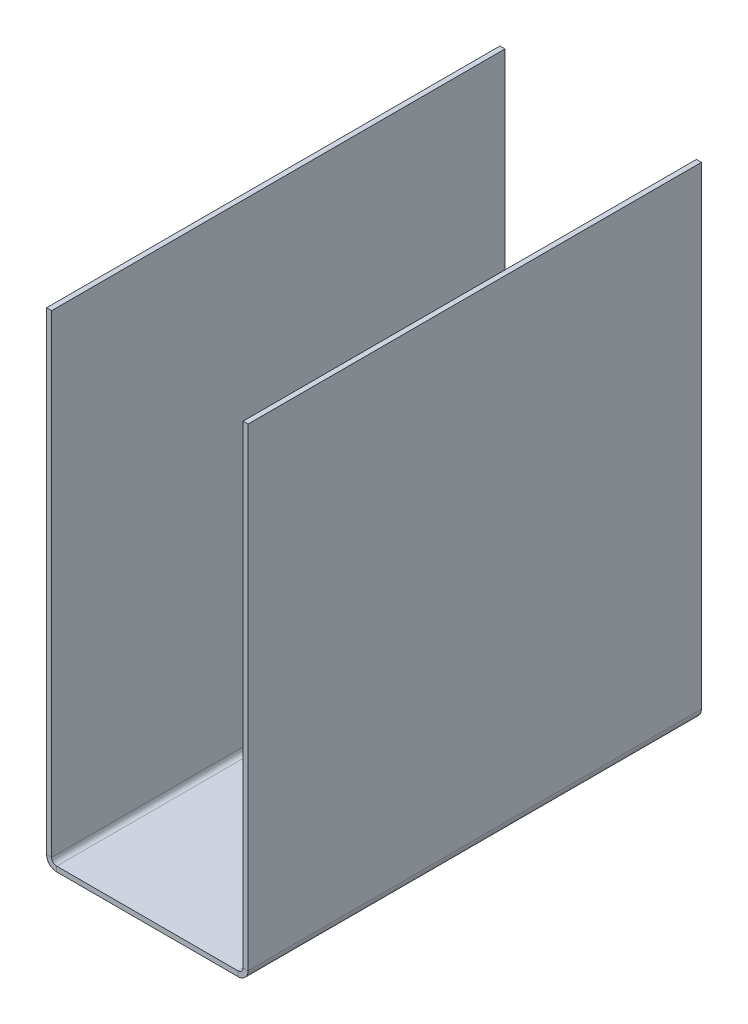
ISO-10303-21;
HEADER;
FILE_DESCRIPTION(('STEP AP214'),'2;1');
FILE_NAME('part.step','',(''),(''),'','','');
FILE_SCHEMA(('AUTOMOTIVE_DESIGN { 1 0 10303 214 1 1 1 1 }'));
ENDSEC;
DATA;
#1=APPLICATION_CONTEXT('core data for automotive mechanical design processes');
#2=APPLICATION_PROTOCOL_DEFINITION('international standard','automotive_design',2000,#1);
#3=PRODUCT_CONTEXT('',#1,'mechanical');
#4=PRODUCT('Part','Part','',(#3));
#5=PRODUCT_RELATED_PRODUCT_CATEGORY('part','',(#4));
#6=PRODUCT_DEFINITION_FORMATION('','',#4);
#7=PRODUCT_DEFINITION_CONTEXT('part definition',#1,'design');
#8=PRODUCT_DEFINITION('design','',#6,#7);
#9=PRODUCT_DEFINITION_SHAPE('','',#8);
#10=(LENGTH_UNIT() NAMED_UNIT(*) SI_UNIT(.MILLI.,.METRE.));
#11=(NAMED_UNIT(*) PLANE_ANGLE_UNIT() SI_UNIT($,.RADIAN.));
#12=(NAMED_UNIT(*) SI_UNIT($,.STERADIAN.) SOLID_ANGLE_UNIT());
#13=UNCERTAINTY_MEASURE_WITH_UNIT(LENGTH_MEASURE(1.E-05),#10,'distance_accuracy_value','');
#14=(GEOMETRIC_REPRESENTATION_CONTEXT(3) GLOBAL_UNCERTAINTY_ASSIGNED_CONTEXT((#13)) GLOBAL_UNIT_ASSIGNED_CONTEXT((#10,
#11,#12)) REPRESENTATION_CONTEXT('',''));
#15=CARTESIAN_POINT('',(0.,0.,0.));
#16=DIRECTION('',(0.,0.,1.));
#17=DIRECTION('',(1.,0.,0.));
#18=AXIS2_PLACEMENT_3D('',#15,#16,#17);
#19=CARTESIAN_POINT('',(-95.,-235.,5.));
#20=DIRECTION('',(0.,0.,1.));
#21=DIRECTION('',(-1.,0.,0.));
#22=AXIS2_PLACEMENT_3D('',#19,#20,#21);
#23=PLANE('',#22);
#24=DIRECTION('',(0.,1.,0.));
#25=VECTOR('',#24,1.);
#26=CARTESIAN_POINT('',(90.,-235.,5.));
#27=LINE('',#26,#25);
#28=CARTESIAN_POINT('',(90.,-240.,5.));
#29=VERTEX_POINT('',#28);
#30=CARTESIAN_POINT('',(90.,-235.,5.));
#31=VERTEX_POINT('',#30);
#32=EDGE_CURVE('E11',#29,#31,#27,.T.);
#33=ORIENTED_EDGE('',*,*,#32,.F.);
#34=DIRECTION('',(1.,0.,0.));
#35=VECTOR('',#34,1.);
#36=CARTESIAN_POINT('',(-95.,-240.,5.));
#37=LINE('',#36,#35);
#38=CARTESIAN_POINT('',(-90.,-240.,5.));
#39=VERTEX_POINT('',#38);
#40=EDGE_CURVE('E93',#29,#39,#37,.F.);
#41=ORIENTED_EDGE('',*,*,#40,.T.);
#42=DIRECTION('',(0.,1.,0.));
#43=VECTOR('',#42,1.);
#44=CARTESIAN_POINT('',(-90.,-235.,5.));
#45=LINE('',#44,#43);
#46=CARTESIAN_POINT('',(-90.,-235.,5.));
#47=VERTEX_POINT('',#46);
#48=EDGE_CURVE('E46',#39,#47,#45,.T.);
#49=ORIENTED_EDGE('',*,*,#48,.T.);
#50=DIRECTION('',(-1.,0.,0.));
#51=VECTOR('',#50,1.);
#52=CARTESIAN_POINT('',(-95.,-235.,5.));
#53=LINE('',#52,#51);
#54=EDGE_CURVE('E95',#31,#47,#53,.T.);
#55=ORIENTED_EDGE('',*,*,#54,.F.);
#56=EDGE_LOOP('',(#33,#41,#49,#55));
#57=FACE_BOUND('',#56,.T.);
#58=ADVANCED_FACE('F36',(#57),#23,.F.);
#59=CARTESIAN_POINT('',(-90.,-230.,5.));
#60=DIRECTION('',(0.,0.,-1.));
#61=DIRECTION('',(-1.,0.,0.));
#62=AXIS2_PLACEMENT_3D('',#59,#60,#61);
#63=PLANE('',#62);
#64=ORIENTED_EDGE('',*,*,#48,.F.);
#65=CARTESIAN_POINT('',(-90.,-230.,5.));
#66=DIRECTION('',(0.,0.,1.));
#67=DIRECTION('',(1.,0.,0.));
#68=AXIS2_PLACEMENT_3D('',#65,#66,#67);
#69=CIRCLE('',#68,10.);
#70=CARTESIAN_POINT('',(-99.9999999999999,-230.,5.));
#71=VERTEX_POINT('',#70);
#72=EDGE_CURVE('E134',#39,#71,#69,.F.);
#73=ORIENTED_EDGE('',*,*,#72,.T.);
#74=DIRECTION('',(1.,0.,0.));
#75=VECTOR('',#74,1.);
#76=CARTESIAN_POINT('',(-95.,-230.,5.));
#77=LINE('',#76,#75);
#78=CARTESIAN_POINT('',(-95.,-230.,5.));
#79=VERTEX_POINT('',#78);
#80=EDGE_CURVE('E161',#71,#79,#77,.T.);
#81=ORIENTED_EDGE('',*,*,#80,.T.);
#82=CARTESIAN_POINT('',(-90.,-230.,5.));
#83=DIRECTION('',(0.,0.,1.));
#84=DIRECTION('',(1.,0.,0.));
#85=AXIS2_PLACEMENT_3D('',#82,#83,#84);
#86=CIRCLE('',#85,5.);
#87=EDGE_CURVE('E170',#47,#79,#86,.F.);
#88=ORIENTED_EDGE('',*,*,#87,.F.);
#89=EDGE_LOOP('',(#64,#73,#81,#88));
#90=FACE_BOUND('',#89,.T.);
#91=ADVANCED_FACE('F169',(#90),#63,.T.);
#92=CARTESIAN_POINT('',(-95.,240.,5.));
#93=DIRECTION('',(0.,0.,1.));
#94=DIRECTION('',(0.,1.,0.));
#95=AXIS2_PLACEMENT_3D('',#92,#93,#94);
#96=PLANE('',#95);
#97=ORIENTED_EDGE('',*,*,#80,.F.);
#98=DIRECTION('',(0.,-1.,0.));
#99=VECTOR('',#98,1.);
#100=CARTESIAN_POINT('',(-100.,240.,5.));
#101=LINE('',#100,#99);
#102=CARTESIAN_POINT('',(-100.,240.,5.));
#103=VERTEX_POINT('',#102);
#104=EDGE_CURVE('E131',#71,#103,#101,.F.);
#105=ORIENTED_EDGE('',*,*,#104,.T.);
#106=DIRECTION('',(1.,0.,0.));
#107=VECTOR('',#106,1.);
#108=CARTESIAN_POINT('',(-95.,240.,5.));
#109=LINE('',#108,#107);
#110=CARTESIAN_POINT('',(-95.,240.,5.));
#111=VERTEX_POINT('',#110);
#112=EDGE_CURVE('E158',#103,#111,#109,.T.);
#113=ORIENTED_EDGE('',*,*,#112,.T.);
#114=DIRECTION('',(0.,1.,0.));
#115=VECTOR('',#114,1.);
#116=CARTESIAN_POINT('',(-95.,240.,5.));
#117=LINE('',#116,#115);
#118=EDGE_CURVE('E189',#79,#111,#117,.T.);
#119=ORIENTED_EDGE('',*,*,#118,.F.);
#120=EDGE_LOOP('',(#97,#105,#113,#119));
#121=FACE_BOUND('',#120,.T.);
#122=ADVANCED_FACE('F190',(#121),#96,.F.);
#123=CARTESIAN_POINT('',(-95.,240.,455.));
#124=DIRECTION('',(0.,1.,0.));
#125=DIRECTION('',(0.,0.,-1.));
#126=AXIS2_PLACEMENT_3D('',#123,#124,#125);
#127=PLANE('',#126);
#128=ORIENTED_EDGE('',*,*,#112,.F.);
#129=DIRECTION('',(0.,0.,1.));
#130=VECTOR('',#129,1.);
#131=CARTESIAN_POINT('',(-100.,240.,455.));
#132=LINE('',#131,#130);
#133=CARTESIAN_POINT('',(-100.,240.,455.));
#134=VERTEX_POINT('',#133);
#135=EDGE_CURVE('E227',#134,#103,#132,.F.);
#136=ORIENTED_EDGE('',*,*,#135,.F.);
#137=DIRECTION('',(1.,0.,0.));
#138=VECTOR('',#137,1.);
#139=CARTESIAN_POINT('',(-95.,240.,455.));
#140=LINE('',#139,#138);
#141=CARTESIAN_POINT('',(-95.,240.,455.));
#142=VERTEX_POINT('',#141);
#143=EDGE_CURVE('E155',#134,#142,#140,.T.);
#144=ORIENTED_EDGE('',*,*,#143,.T.);
#145=DIRECTION('',(0.,0.,-1.));
#146=VECTOR('',#145,1.);
#147=CARTESIAN_POINT('',(-95.,240.,455.));
#148=LINE('',#147,#146);
#149=EDGE_CURVE('E194',#142,#111,#148,.T.);
#150=ORIENTED_EDGE('',*,*,#149,.T.);
#151=EDGE_LOOP('',(#128,#136,#144,#150));
#152=FACE_BOUND('',#151,.T.);
#153=ADVANCED_FACE('F238',(#152),#127,.T.);
#154=CARTESIAN_POINT('',(-95.,240.,455.));
#155=DIRECTION('',(0.,0.,1.));
#156=DIRECTION('',(0.,1.,0.));
#157=AXIS2_PLACEMENT_3D('',#154,#155,#156);
#158=PLANE('',#157);
#159=ORIENTED_EDGE('',*,*,#143,.F.);
#160=DIRECTION('',(0.,-1.,0.));
#161=VECTOR('',#160,1.);
#162=CARTESIAN_POINT('',(-100.,240.,455.));
#163=LINE('',#162,#161);
#164=CARTESIAN_POINT('',(-100.,-230.,455.));
#165=VERTEX_POINT('',#164);
#166=EDGE_CURVE('E124',#165,#134,#163,.F.);
#167=ORIENTED_EDGE('',*,*,#166,.F.);
#168=DIRECTION('',(1.,0.,0.));
#169=VECTOR('',#168,1.);
#170=CARTESIAN_POINT('',(-95.,-230.,455.));
#171=LINE('',#170,#169);
#172=CARTESIAN_POINT('',(-95.,-230.,455.));
#173=VERTEX_POINT('',#172);
#174=EDGE_CURVE('E152',#165,#173,#171,.T.);
#175=ORIENTED_EDGE('',*,*,#174,.T.);
#176=DIRECTION('',(0.,1.,0.));
#177=VECTOR('',#176,1.);
#178=CARTESIAN_POINT('',(-95.,240.,455.));
#179=LINE('',#178,#177);
#180=EDGE_CURVE('E200',#173,#142,#179,.T.);
#181=ORIENTED_EDGE('',*,*,#180,.T.);
#182=EDGE_LOOP('',(#159,#167,#175,#181));
#183=FACE_BOUND('',#182,.T.);
#184=ADVANCED_FACE('F288',(#183),#158,.T.);
#185=CARTESIAN_POINT('',(-90.,-230.,455.));
#186=DIRECTION('',(0.,0.,1.));
#187=DIRECTION('',(1.,0.,0.));
#188=AXIS2_PLACEMENT_3D('',#185,#186,#187);
#189=PLANE('',#188);
#190=ORIENTED_EDGE('',*,*,#174,.F.);
#191=CARTESIAN_POINT('',(-90.,-230.,455.));
#192=DIRECTION('',(0.,0.,1.));
#193=DIRECTION('',(1.,0.,0.));
#194=AXIS2_PLACEMENT_3D('',#191,#192,#193);
#195=CIRCLE('',#194,10.);
#196=CARTESIAN_POINT('',(-90.,-240.,455.));
#197=VERTEX_POINT('',#196);
#198=EDGE_CURVE('E129',#165,#197,#195,.T.);
#199=ORIENTED_EDGE('',*,*,#198,.T.);
#200=DIRECTION('',(0.,1.,0.));
#201=VECTOR('',#200,1.);
#202=CARTESIAN_POINT('',(-90.,-235.,455.));
#203=LINE('',#202,#201);
#204=CARTESIAN_POINT('',(-90.,-235.,455.));
#205=VERTEX_POINT('',#204);
#206=EDGE_CURVE('E150',#197,#205,#203,.T.);
#207=ORIENTED_EDGE('',*,*,#206,.T.);
#208=CARTESIAN_POINT('',(-90.,-230.,455.));
#209=DIRECTION('',(0.,0.,-1.));
#210=DIRECTION('',(-1.,0.,0.));
#211=AXIS2_PLACEMENT_3D('',#208,#209,#210);
#212=CIRCLE('',#211,5.);
#213=EDGE_CURVE('E186',#173,#205,#212,.F.);
#214=ORIENTED_EDGE('',*,*,#213,.F.);
#215=EDGE_LOOP('',(#190,#199,#207,#214));
#216=FACE_BOUND('',#215,.T.);
#217=ADVANCED_FACE('F290',(#216),#189,.T.);
#218=CARTESIAN_POINT('',(-95.,-235.,455.));
#219=DIRECTION('',(0.,0.,1.));
#220=DIRECTION('',(-1.,0.,0.));
#221=AXIS2_PLACEMENT_3D('',#218,#219,#220);
#222=PLANE('',#221);
#223=ORIENTED_EDGE('',*,*,#206,.F.);
#224=DIRECTION('',(1.,0.,0.));
#225=VECTOR('',#224,1.);
#226=CARTESIAN_POINT('',(-95.,-240.,455.));
#227=LINE('',#226,#225);
#228=CARTESIAN_POINT('',(90.,-240.,455.));
#229=VERTEX_POINT('',#228);
#230=EDGE_CURVE('E123',#229,#197,#227,.F.);
#231=ORIENTED_EDGE('',*,*,#230,.F.);
#232=DIRECTION('',(0.,1.,0.));
#233=VECTOR('',#232,1.);
#234=CARTESIAN_POINT('',(90.,-235.,455.));
#235=LINE('',#234,#233);
#236=CARTESIAN_POINT('',(90.,-235.,455.));
#237=VERTEX_POINT('',#236);
#238=EDGE_CURVE('E147',#229,#237,#235,.T.);
#239=ORIENTED_EDGE('',*,*,#238,.T.);
#240=DIRECTION('',(-1.,0.,0.));
#241=VECTOR('',#240,1.);
#242=CARTESIAN_POINT('',(-95.,-235.,455.));
#243=LINE('',#242,#241);
#244=EDGE_CURVE('E245',#237,#205,#243,.T.);
#245=ORIENTED_EDGE('',*,*,#244,.T.);
#246=EDGE_LOOP('',(#223,#231,#239,#245));
#247=FACE_BOUND('',#246,.T.);
#248=ADVANCED_FACE('F293',(#247),#222,.T.);
#249=CARTESIAN_POINT('',(90.,-230.,455.));
#250=DIRECTION('',(0.,0.,1.));
#251=DIRECTION('',(1.,0.,0.));
#252=AXIS2_PLACEMENT_3D('',#249,#250,#251);
#253=PLANE('',#252);
#254=ORIENTED_EDGE('',*,*,#238,.F.);
#255=CARTESIAN_POINT('',(90.,-230.,455.));
#256=DIRECTION('',(0.,0.,1.));
#257=DIRECTION('',(1.,0.,0.));
#258=AXIS2_PLACEMENT_3D('',#255,#256,#257);
#259=CIRCLE('',#258,10.);
#260=CARTESIAN_POINT('',(100.,-230.,455.));
#261=VERTEX_POINT('',#260);
#262=EDGE_CURVE('E111',#229,#261,#259,.T.);
#263=ORIENTED_EDGE('',*,*,#262,.T.);
#264=DIRECTION('',(-1.,0.,0.));
#265=VECTOR('',#264,1.);
#266=CARTESIAN_POINT('',(95.,-230.,455.));
#267=LINE('',#266,#265);
#268=CARTESIAN_POINT('',(95.,-230.,455.));
#269=VERTEX_POINT('',#268);
#270=EDGE_CURVE('E144',#261,#269,#267,.T.);
#271=ORIENTED_EDGE('',*,*,#270,.T.);
#272=CARTESIAN_POINT('',(90.,-230.,455.));
#273=DIRECTION('',(0.,0.,-1.));
#274=DIRECTION('',(-1.,0.,0.));
#275=AXIS2_PLACEMENT_3D('',#272,#273,#274);
#276=CIRCLE('',#275,5.);
#277=EDGE_CURVE('E195',#237,#269,#276,.F.);
#278=ORIENTED_EDGE('',*,*,#277,.F.);
#279=EDGE_LOOP('',(#254,#263,#271,#278));
#280=FACE_BOUND('',#279,.T.);
#281=ADVANCED_FACE('F320',(#280),#253,.T.);
#282=CARTESIAN_POINT('',(95.,-235.,455.));
#283=DIRECTION('',(0.,0.,1.));
#284=DIRECTION('',(0.,-1.,0.));
#285=AXIS2_PLACEMENT_3D('',#282,#283,#284);
#286=PLANE('',#285);
#287=ORIENTED_EDGE('',*,*,#270,.F.);
#288=DIRECTION('',(0.,1.,0.));
#289=VECTOR('',#288,1.);
#290=CARTESIAN_POINT('',(100.,-235.,455.));
#291=LINE('',#290,#289);
#292=CARTESIAN_POINT('',(100.,240.,455.));
#293=VERTEX_POINT('',#292);
#294=EDGE_CURVE('E219',#293,#261,#291,.F.);
#295=ORIENTED_EDGE('',*,*,#294,.F.);
#296=DIRECTION('',(-1.,0.,0.));
#297=VECTOR('',#296,1.);
#298=CARTESIAN_POINT('',(95.,240.,455.));
#299=LINE('',#298,#297);
#300=CARTESIAN_POINT('',(95.,240.,455.));
#301=VERTEX_POINT('',#300);
#302=EDGE_CURVE('E141',#293,#301,#299,.T.);
#303=ORIENTED_EDGE('',*,*,#302,.T.);
#304=DIRECTION('',(0.,-1.,0.));
#305=VECTOR('',#304,1.);
#306=CARTESIAN_POINT('',(95.,-235.,455.));
#307=LINE('',#306,#305);
#308=EDGE_CURVE('E251',#301,#269,#307,.T.);
#309=ORIENTED_EDGE('',*,*,#308,.T.);
#310=EDGE_LOOP('',(#287,#295,#303,#309));
#311=FACE_BOUND('',#310,.T.);
#312=ADVANCED_FACE('F269',(#311),#286,.T.);
#313=CARTESIAN_POINT('',(95.,240.,455.));
#314=DIRECTION('',(0.,-1.,0.));
#315=DIRECTION('',(0.,0.,-1.));
#316=AXIS2_PLACEMENT_3D('',#313,#314,#315);
#317=PLANE('',#316);
#318=ORIENTED_EDGE('',*,*,#302,.F.);
#319=DIRECTION('',(0.,0.,1.));
#320=VECTOR('',#319,1.);
#321=CARTESIAN_POINT('',(100.,240.,455.));
#322=LINE('',#321,#320);
#323=CARTESIAN_POINT('',(100.,240.,5.));
#324=VERTEX_POINT('',#323);
#325=EDGE_CURVE('E116',#293,#324,#322,.F.);
#326=ORIENTED_EDGE('',*,*,#325,.T.);
#327=DIRECTION('',(-1.,0.,0.));
#328=VECTOR('',#327,1.);
#329=CARTESIAN_POINT('',(95.,240.,5.));
#330=LINE('',#329,#328);
#331=CARTESIAN_POINT('',(95.,240.,5.));
#332=VERTEX_POINT('',#331);
#333=EDGE_CURVE('E138',#324,#332,#330,.T.);
#334=ORIENTED_EDGE('',*,*,#333,.T.);
#335=DIRECTION('',(0.,0.,-1.));
#336=VECTOR('',#335,1.);
#337=CARTESIAN_POINT('',(95.,240.,455.));
#338=LINE('',#337,#336);
#339=EDGE_CURVE('E254',#301,#332,#338,.T.);
#340=ORIENTED_EDGE('',*,*,#339,.F.);
#341=EDGE_LOOP('',(#318,#326,#334,#340));
#342=FACE_BOUND('',#341,.T.);
#343=ADVANCED_FACE('F325',(#342),#317,.F.);
#344=CARTESIAN_POINT('',(95.,-235.,5.));
#345=DIRECTION('',(0.,0.,1.));
#346=DIRECTION('',(0.,-1.,0.));
#347=AXIS2_PLACEMENT_3D('',#344,#345,#346);
#348=PLANE('',#347);
#349=ORIENTED_EDGE('',*,*,#333,.F.);
#350=DIRECTION('',(0.,1.,0.));
#351=VECTOR('',#350,1.);
#352=CARTESIAN_POINT('',(100.,-235.,5.));
#353=LINE('',#352,#351);
#354=CARTESIAN_POINT('',(100.,-230.,5.));
#355=VERTEX_POINT('',#354);
#356=EDGE_CURVE('E217',#324,#355,#353,.F.);
#357=ORIENTED_EDGE('',*,*,#356,.T.);
#358=DIRECTION('',(-1.,0.,0.));
#359=VECTOR('',#358,1.);
#360=CARTESIAN_POINT('',(95.,-230.,5.));
#361=LINE('',#360,#359);
#362=CARTESIAN_POINT('',(95.,-230.,5.));
#363=VERTEX_POINT('',#362);
#364=EDGE_CURVE('E40',#355,#363,#361,.T.);
#365=ORIENTED_EDGE('',*,*,#364,.T.);
#366=DIRECTION('',(0.,-1.,0.));
#367=VECTOR('',#366,1.);
#368=CARTESIAN_POINT('',(95.,-235.,5.));
#369=LINE('',#368,#367);
#370=EDGE_CURVE('E248',#332,#363,#369,.T.);
#371=ORIENTED_EDGE('',*,*,#370,.F.);
#372=EDGE_LOOP('',(#349,#357,#365,#371));
#373=FACE_BOUND('',#372,.T.);
#374=ADVANCED_FACE('F279',(#373),#348,.F.);
#375=CARTESIAN_POINT('',(90.,-230.,5.));
#376=DIRECTION('',(0.,0.,-1.));
#377=DIRECTION('',(-1.,0.,0.));
#378=AXIS2_PLACEMENT_3D('',#375,#376,#377);
#379=PLANE('',#378);
#380=CARTESIAN_POINT('',(90.,-230.,5.));
#381=DIRECTION('',(0.,0.,1.));
#382=DIRECTION('',(1.,0.,0.));
#383=AXIS2_PLACEMENT_3D('',#380,#381,#382);
#384=CIRCLE('',#383,10.);
#385=EDGE_CURVE('E108',#355,#29,#384,.F.);
#386=ORIENTED_EDGE('',*,*,#385,.T.);
#387=ORIENTED_EDGE('',*,*,#32,.T.);
#388=CARTESIAN_POINT('',(90.,-230.,5.));
#389=DIRECTION('',(0.,0.,1.));
#390=DIRECTION('',(1.,0.,0.));
#391=AXIS2_PLACEMENT_3D('',#388,#389,#390);
#392=CIRCLE('',#391,5.);
#393=EDGE_CURVE('E212',#363,#31,#392,.F.);
#394=ORIENTED_EDGE('',*,*,#393,.F.);
#395=ORIENTED_EDGE('',*,*,#364,.F.);
#396=EDGE_LOOP('',(#386,#387,#394,#395));
#397=FACE_BOUND('',#396,.T.);
#398=ADVANCED_FACE('F38',(#397),#379,.T.);
#399=CARTESIAN_POINT('',(95.,-235.,455.));
#400=DIRECTION('',(1.,0.,0.));
#401=DIRECTION('',(0.,1.,0.));
#402=AXIS2_PLACEMENT_3D('',#399,#400,#401);
#403=PLANE('',#402);
#404=ORIENTED_EDGE('',*,*,#370,.T.);
#405=DIRECTION('',(0.,0.,-1.));
#406=VECTOR('',#405,1.);
#407=CARTESIAN_POINT('',(95.,-230.,455.));
#408=LINE('',#407,#406);
#409=EDGE_CURVE('E202',#363,#269,#408,.F.);
#410=ORIENTED_EDGE('',*,*,#409,.T.);
#411=ORIENTED_EDGE('',*,*,#308,.F.);
#412=ORIENTED_EDGE('',*,*,#339,.T.);
#413=EDGE_LOOP('',(#404,#410,#411,#412));
#414=FACE_BOUND('',#413,.T.);
#415=ADVANCED_FACE('F274',(#414),#403,.F.);
#416=CARTESIAN_POINT('',(-95.,-235.,455.));
#417=DIRECTION('',(0.,-1.,0.));
#418=DIRECTION('',(0.,0.,-1.));
#419=AXIS2_PLACEMENT_3D('',#416,#417,#418);
#420=PLANE('',#419);
#421=ORIENTED_EDGE('',*,*,#54,.T.);
#422=DIRECTION('',(0.,0.,-1.));
#423=VECTOR('',#422,1.);
#424=CARTESIAN_POINT('',(-90.,-235.,455.));
#425=LINE('',#424,#423);
#426=EDGE_CURVE('E185',#47,#205,#425,.F.);
#427=ORIENTED_EDGE('',*,*,#426,.T.);
#428=ORIENTED_EDGE('',*,*,#244,.F.);
#429=DIRECTION('',(0.,0.,-1.));
#430=VECTOR('',#429,1.);
#431=CARTESIAN_POINT('',(90.,-235.,5.));
#432=LINE('',#431,#430);
#433=EDGE_CURVE('E206',#237,#31,#432,.T.);
#434=ORIENTED_EDGE('',*,*,#433,.T.);
#435=EDGE_LOOP('',(#421,#427,#428,#434));
#436=FACE_BOUND('',#435,.T.);
#437=ADVANCED_FACE('F295',(#436),#420,.F.);
#438=CARTESIAN_POINT('',(-95.,240.,455.));
#439=DIRECTION('',(-1.,0.,0.));
#440=DIRECTION('',(0.,-1.,0.));
#441=AXIS2_PLACEMENT_3D('',#438,#439,#440);
#442=PLANE('',#441);
#443=ORIENTED_EDGE('',*,*,#180,.F.);
#444=DIRECTION('',(0.,0.,-1.));
#445=VECTOR('',#444,1.);
#446=CARTESIAN_POINT('',(-95.,-230.,5.));
#447=LINE('',#446,#445);
#448=EDGE_CURVE('E183',#173,#79,#447,.T.);
#449=ORIENTED_EDGE('',*,*,#448,.T.);
#450=ORIENTED_EDGE('',*,*,#118,.T.);
#451=ORIENTED_EDGE('',*,*,#149,.F.);
#452=EDGE_LOOP('',(#443,#449,#450,#451));
#453=FACE_BOUND('',#452,.T.);
#454=ADVANCED_FACE('F198',(#453),#442,.F.);
#455=CARTESIAN_POINT('',(90.,-230.,455.));
#456=DIRECTION('',(0.,0.,1.));
#457=DIRECTION('',(1.,0.,0.));
#458=AXIS2_PLACEMENT_3D('',#455,#456,#457);
#459=CYLINDRICAL_SURFACE('',#458,5.);
#460=ORIENTED_EDGE('',*,*,#277,.T.);
#461=ORIENTED_EDGE('',*,*,#409,.F.);
#462=ORIENTED_EDGE('',*,*,#393,.T.);
#463=ORIENTED_EDGE('',*,*,#433,.F.);
#464=EDGE_LOOP('',(#460,#461,#462,#463));
#465=FACE_BOUND('',#464,.T.);
#466=ADVANCED_FACE('F262',(#465),#459,.F.);
#467=CARTESIAN_POINT('',(-90.,-230.,455.));
#468=DIRECTION('',(0.,0.,1.));
#469=DIRECTION('',(1.,0.,0.));
#470=AXIS2_PLACEMENT_3D('',#467,#468,#469);
#471=CYLINDRICAL_SURFACE('',#470,5.);
#472=ORIENTED_EDGE('',*,*,#213,.T.);
#473=ORIENTED_EDGE('',*,*,#426,.F.);
#474=ORIENTED_EDGE('',*,*,#87,.T.);
#475=ORIENTED_EDGE('',*,*,#448,.F.);
#476=EDGE_LOOP('',(#472,#473,#474,#475));
#477=FACE_BOUND('',#476,.T.);
#478=ADVANCED_FACE('F181',(#477),#471,.F.);
#479=CARTESIAN_POINT('',(100.,-235.,455.));
#480=DIRECTION('',(1.,0.,0.));
#481=DIRECTION('',(0.,1.,0.));
#482=AXIS2_PLACEMENT_3D('',#479,#480,#481);
#483=PLANE('',#482);
#484=ORIENTED_EDGE('',*,*,#356,.F.);
#485=ORIENTED_EDGE('',*,*,#325,.F.);
#486=ORIENTED_EDGE('',*,*,#294,.T.);
#487=DIRECTION('',(0.,0.,1.));
#488=VECTOR('',#487,1.);
#489=CARTESIAN_POINT('',(100.,-230.,455.));
#490=LINE('',#489,#488);
#491=EDGE_CURVE('E115',#355,#261,#490,.T.);
#492=ORIENTED_EDGE('',*,*,#491,.F.);
#493=EDGE_LOOP('',(#484,#485,#486,#492));
#494=FACE_BOUND('',#493,.T.);
#495=ADVANCED_FACE('F340',(#494),#483,.T.);
#496=CARTESIAN_POINT('',(-95.,-240.,455.));
#497=DIRECTION('',(0.,-1.,0.));
#498=DIRECTION('',(0.,0.,-1.));
#499=AXIS2_PLACEMENT_3D('',#496,#497,#498);
#500=PLANE('',#499);
#501=ORIENTED_EDGE('',*,*,#40,.F.);
#502=DIRECTION('',(0.,0.,-1.));
#503=VECTOR('',#502,1.);
#504=CARTESIAN_POINT('',(90.,-240.,455.));
#505=LINE('',#504,#503);
#506=EDGE_CURVE('E105',#229,#29,#505,.T.);
#507=ORIENTED_EDGE('',*,*,#506,.F.);
#508=ORIENTED_EDGE('',*,*,#230,.T.);
#509=DIRECTION('',(0.,0.,-1.));
#510=VECTOR('',#509,1.);
#511=CARTESIAN_POINT('',(-90.,-240.,455.));
#512=LINE('',#511,#510);
#513=EDGE_CURVE('E121',#39,#197,#512,.F.);
#514=ORIENTED_EDGE('',*,*,#513,.F.);
#515=EDGE_LOOP('',(#501,#507,#508,#514));
#516=FACE_BOUND('',#515,.T.);
#517=ADVANCED_FACE('F119',(#516),#500,.T.);
#518=CARTESIAN_POINT('',(-100.,240.,455.));
#519=DIRECTION('',(-1.,0.,0.));
#520=DIRECTION('',(0.,-1.,0.));
#521=AXIS2_PLACEMENT_3D('',#518,#519,#520);
#522=PLANE('',#521);
#523=ORIENTED_EDGE('',*,*,#166,.T.);
#524=ORIENTED_EDGE('',*,*,#135,.T.);
#525=ORIENTED_EDGE('',*,*,#104,.F.);
#526=DIRECTION('',(0.,0.,1.));
#527=VECTOR('',#526,1.);
#528=CARTESIAN_POINT('',(-100.,-230.,455.));
#529=LINE('',#528,#527);
#530=EDGE_CURVE('E213',#165,#71,#529,.F.);
#531=ORIENTED_EDGE('',*,*,#530,.F.);
#532=EDGE_LOOP('',(#523,#524,#525,#531));
#533=FACE_BOUND('',#532,.T.);
#534=ADVANCED_FACE('F233',(#533),#522,.T.);
#535=CARTESIAN_POINT('',(90.,-230.,455.));
#536=DIRECTION('',(0.,0.,1.));
#537=DIRECTION('',(1.,0.,0.));
#538=AXIS2_PLACEMENT_3D('',#535,#536,#537);
#539=CYLINDRICAL_SURFACE('',#538,10.);
#540=ORIENTED_EDGE('',*,*,#262,.F.);
#541=ORIENTED_EDGE('',*,*,#506,.T.);
#542=ORIENTED_EDGE('',*,*,#385,.F.);
#543=ORIENTED_EDGE('',*,*,#491,.T.);
#544=EDGE_LOOP('',(#540,#541,#542,#543));
#545=FACE_BOUND('',#544,.T.);
#546=ADVANCED_FACE('F106',(#545),#539,.T.);
#547=CARTESIAN_POINT('',(-90.,-230.,455.));
#548=DIRECTION('',(0.,0.,1.));
#549=DIRECTION('',(1.,0.,0.));
#550=AXIS2_PLACEMENT_3D('',#547,#548,#549);
#551=CYLINDRICAL_SURFACE('',#550,10.);
#552=ORIENTED_EDGE('',*,*,#198,.F.);
#553=ORIENTED_EDGE('',*,*,#530,.T.);
#554=ORIENTED_EDGE('',*,*,#72,.F.);
#555=ORIENTED_EDGE('',*,*,#513,.T.);
#556=EDGE_LOOP('',(#552,#553,#554,#555));
#557=FACE_BOUND('',#556,.T.);
#558=ADVANCED_FACE('F330',(#557),#551,.T.);
#559=CLOSED_SHELL('',(#58,#91,#122,#153,#184,#217,#248,#281,#312,#343,#374,#398,#415,#437,#454,
#466,#478,#495,#517,#534,#546,#558));
#560=MANIFOLD_SOLID_BREP('B2',#559);
#561=ADVANCED_BREP_SHAPE_REPRESENTATION('',(#18,#560),#14);
#562=SHAPE_DEFINITION_REPRESENTATION(#9,#561);
ENDSEC;
END-ISO-10303-21;
